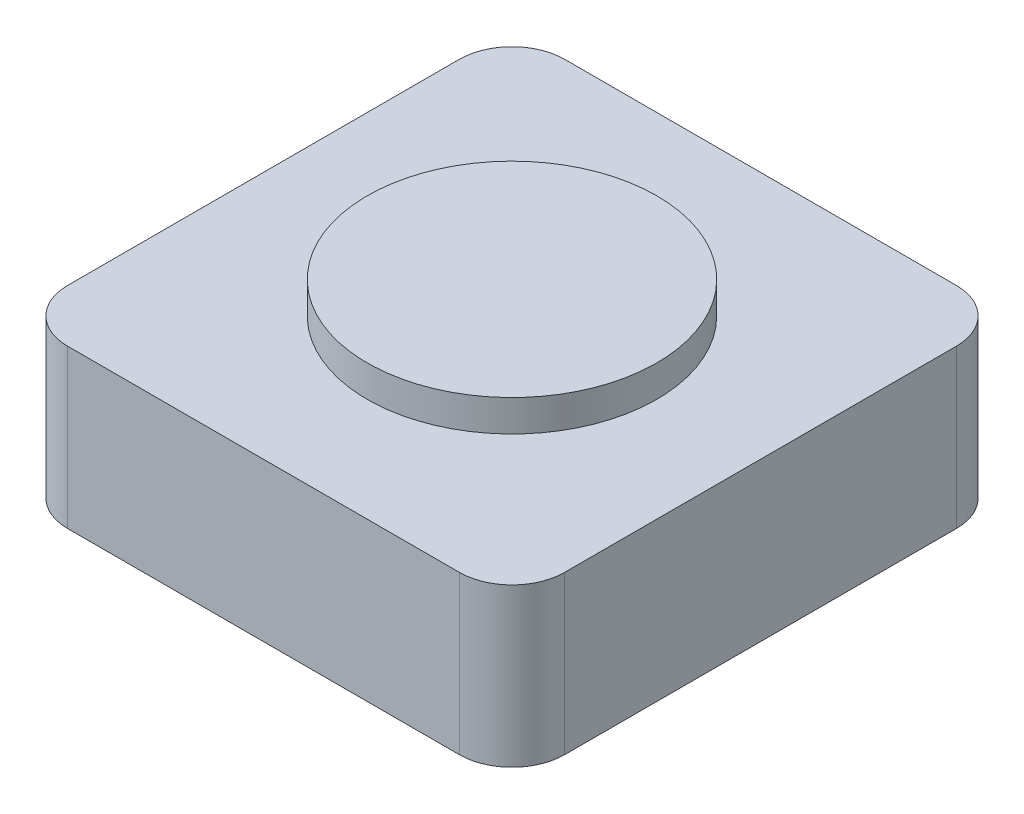
ISO-10303-21;
HEADER;
FILE_DESCRIPTION(('STEP AP214'),'2;1');
FILE_NAME('part.step','',(''),(''),'','','');
FILE_SCHEMA(('AUTOMOTIVE_DESIGN { 1 0 10303 214 1 1 1 1 }'));
ENDSEC;
DATA;
#1=APPLICATION_CONTEXT('core data for automotive mechanical design processes');
#2=APPLICATION_PROTOCOL_DEFINITION('international standard','automotive_design',2000,#1);
#3=PRODUCT_CONTEXT('',#1,'mechanical');
#4=PRODUCT('Part','Part','',(#3));
#5=PRODUCT_RELATED_PRODUCT_CATEGORY('part','',(#4));
#6=PRODUCT_DEFINITION_FORMATION('','',#4);
#7=PRODUCT_DEFINITION_CONTEXT('part definition',#1,'design');
#8=PRODUCT_DEFINITION('design','',#6,#7);
#9=PRODUCT_DEFINITION_SHAPE('','',#8);
#10=(LENGTH_UNIT() NAMED_UNIT(*) SI_UNIT(.MILLI.,.METRE.));
#11=(NAMED_UNIT(*) PLANE_ANGLE_UNIT() SI_UNIT($,.RADIAN.));
#12=(NAMED_UNIT(*) SI_UNIT($,.STERADIAN.) SOLID_ANGLE_UNIT());
#13=UNCERTAINTY_MEASURE_WITH_UNIT(LENGTH_MEASURE(1.E-05),#10,'distance_accuracy_value','');
#14=(GEOMETRIC_REPRESENTATION_CONTEXT(3) GLOBAL_UNCERTAINTY_ASSIGNED_CONTEXT((#13)) GLOBAL_UNIT_ASSIGNED_CONTEXT((#10,
#11,#12)) REPRESENTATION_CONTEXT('',''));
#15=CARTESIAN_POINT('',(0.,0.,0.));
#16=DIRECTION('',(0.,0.,1.));
#17=DIRECTION('',(1.,0.,0.));
#18=AXIS2_PLACEMENT_3D('',#15,#16,#17);
#19=CARTESIAN_POINT('',(5.9944,3.81,5.9944));
#20=DIRECTION('',(-1.,0.,0.));
#21=DIRECTION('',(0.,0.,1.));
#22=AXIS2_PLACEMENT_3D('',#19,#20,#21);
#23=PLANE('',#22);
#24=DIRECTION('',(0.,0.,-1.));
#25=VECTOR('',#24,1.);
#26=CARTESIAN_POINT('',(5.9944,3.81,5.9944));
#27=LINE('',#26,#25);
#28=CARTESIAN_POINT('',(5.9944,3.81,4.7244));
#29=VERTEX_POINT('',#28);
#30=CARTESIAN_POINT('',(5.9944,3.81,-4.7244));
#31=VERTEX_POINT('',#30);
#32=EDGE_CURVE('E118',#29,#31,#27,.T.);
#33=ORIENTED_EDGE('',*,*,#32,.F.);
#34=DIRECTION('',(0.,-1.,0.));
#35=VECTOR('',#34,1.);
#36=CARTESIAN_POINT('',(5.9944,3.81,4.7244));
#37=LINE('',#36,#35);
#38=CARTESIAN_POINT('',(5.9944,0.,4.7244));
#39=VERTEX_POINT('',#38);
#40=EDGE_CURVE('E103',#29,#39,#37,.T.);
#41=ORIENTED_EDGE('',*,*,#40,.T.);
#42=DIRECTION('',(0.,0.,-1.));
#43=VECTOR('',#42,1.);
#44=CARTESIAN_POINT('',(5.9944,0.,5.9944));
#45=LINE('',#44,#43);
#46=CARTESIAN_POINT('',(5.9944,0.,-4.7244));
#47=VERTEX_POINT('',#46);
#48=EDGE_CURVE('E115',#39,#47,#45,.T.);
#49=ORIENTED_EDGE('',*,*,#48,.T.);
#50=DIRECTION('',(0.,-1.,0.));
#51=VECTOR('',#50,1.);
#52=CARTESIAN_POINT('',(5.9944,3.81,-4.7244));
#53=LINE('',#52,#51);
#54=EDGE_CURVE('E120',#47,#31,#53,.F.);
#55=ORIENTED_EDGE('',*,*,#54,.T.);
#56=EDGE_LOOP('',(#33,#41,#49,#55));
#57=FACE_BOUND('',#56,.T.);
#58=ADVANCED_FACE('F32',(#57),#23,.F.);
#59=CARTESIAN_POINT('',(-5.9944,3.81,-5.9944));
#60=DIRECTION('',(0.,0.,1.));
#61=DIRECTION('',(1.,0.,0.));
#62=AXIS2_PLACEMENT_3D('',#59,#60,#61);
#63=PLANE('',#62);
#64=DIRECTION('',(-1.,0.,0.));
#65=VECTOR('',#64,1.);
#66=CARTESIAN_POINT('',(-5.9944,3.81,-5.9944));
#67=LINE('',#66,#65);
#68=CARTESIAN_POINT('',(4.7244,3.81,-5.9944));
#69=VERTEX_POINT('',#68);
#70=CARTESIAN_POINT('',(-4.7244,3.81,-5.9944));
#71=VERTEX_POINT('',#70);
#72=EDGE_CURVE('E164',#69,#71,#67,.T.);
#73=ORIENTED_EDGE('',*,*,#72,.F.);
#74=DIRECTION('',(0.,-1.,0.));
#75=VECTOR('',#74,1.);
#76=CARTESIAN_POINT('',(4.7244,3.81,-5.9944));
#77=LINE('',#76,#75);
#78=CARTESIAN_POINT('',(4.7244,0.,-5.9944));
#79=VERTEX_POINT('',#78);
#80=EDGE_CURVE('E11',#69,#79,#77,.T.);
#81=ORIENTED_EDGE('',*,*,#80,.T.);
#82=DIRECTION('',(-1.,0.,0.));
#83=VECTOR('',#82,1.);
#84=CARTESIAN_POINT('',(-5.9944,0.,-5.9944));
#85=LINE('',#84,#83);
#86=CARTESIAN_POINT('',(-4.7244,0.,-5.9944));
#87=VERTEX_POINT('',#86);
#88=EDGE_CURVE('E125',#79,#87,#85,.T.);
#89=ORIENTED_EDGE('',*,*,#88,.T.);
#90=DIRECTION('',(0.,-1.,0.));
#91=VECTOR('',#90,1.);
#92=CARTESIAN_POINT('',(-4.7244,3.81,-5.9944));
#93=LINE('',#92,#91);
#94=EDGE_CURVE('E40',#87,#71,#93,.F.);
#95=ORIENTED_EDGE('',*,*,#94,.T.);
#96=EDGE_LOOP('',(#73,#81,#89,#95));
#97=FACE_BOUND('',#96,.T.);
#98=ADVANCED_FACE('F163',(#97),#63,.F.);
#99=CARTESIAN_POINT('',(-5.9944,3.81,5.9944));
#100=DIRECTION('',(1.,0.,0.));
#101=DIRECTION('',(0.,0.,-1.));
#102=AXIS2_PLACEMENT_3D('',#99,#100,#101);
#103=PLANE('',#102);
#104=DIRECTION('',(0.,0.,1.));
#105=VECTOR('',#104,1.);
#106=CARTESIAN_POINT('',(-5.9944,0.,5.9944));
#107=LINE('',#106,#105);
#108=CARTESIAN_POINT('',(-5.9944,0.,-4.7244));
#109=VERTEX_POINT('',#108);
#110=CARTESIAN_POINT('',(-5.9944,0.,4.7244));
#111=VERTEX_POINT('',#110);
#112=EDGE_CURVE('E129',#109,#111,#107,.T.);
#113=ORIENTED_EDGE('',*,*,#112,.T.);
#114=DIRECTION('',(0.,-1.,0.));
#115=VECTOR('',#114,1.);
#116=CARTESIAN_POINT('',(-5.9944,3.81,4.7244));
#117=LINE('',#116,#115);
#118=CARTESIAN_POINT('',(-5.9944,3.81,4.7244));
#119=VERTEX_POINT('',#118);
#120=EDGE_CURVE('E47',#111,#119,#117,.F.);
#121=ORIENTED_EDGE('',*,*,#120,.T.);
#122=DIRECTION('',(0.,0.,1.));
#123=VECTOR('',#122,1.);
#124=CARTESIAN_POINT('',(-5.9944,3.81,5.9944));
#125=LINE('',#124,#123);
#126=CARTESIAN_POINT('',(-5.9944,3.81,-4.7244));
#127=VERTEX_POINT('',#126);
#128=EDGE_CURVE('E170',#127,#119,#125,.T.);
#129=ORIENTED_EDGE('',*,*,#128,.F.);
#130=DIRECTION('',(0.,-1.,0.));
#131=VECTOR('',#130,1.);
#132=CARTESIAN_POINT('',(-5.9944,3.81,-4.7244));
#133=LINE('',#132,#131);
#134=EDGE_CURVE('E157',#127,#109,#133,.T.);
#135=ORIENTED_EDGE('',*,*,#134,.T.);
#136=EDGE_LOOP('',(#113,#121,#129,#135));
#137=FACE_BOUND('',#136,.T.);
#138=ADVANCED_FACE('F174',(#137),#103,.F.);
#139=CARTESIAN_POINT('',(-5.9944,3.81,5.9944));
#140=DIRECTION('',(0.,0.,-1.));
#141=DIRECTION('',(-1.,0.,0.));
#142=AXIS2_PLACEMENT_3D('',#139,#140,#141);
#143=PLANE('',#142);
#144=DIRECTION('',(1.,0.,0.));
#145=VECTOR('',#144,1.);
#146=CARTESIAN_POINT('',(-5.9944,0.,5.9944));
#147=LINE('',#146,#145);
#148=CARTESIAN_POINT('',(-4.7244,0.,5.9944));
#149=VERTEX_POINT('',#148);
#150=CARTESIAN_POINT('',(4.7244,0.,5.9944));
#151=VERTEX_POINT('',#150);
#152=EDGE_CURVE('E138',#149,#151,#147,.T.);
#153=ORIENTED_EDGE('',*,*,#152,.T.);
#154=DIRECTION('',(0.,-1.,0.));
#155=VECTOR('',#154,1.);
#156=CARTESIAN_POINT('',(4.7244,3.81,5.9944));
#157=LINE('',#156,#155);
#158=CARTESIAN_POINT('',(4.7244,3.81,5.9944));
#159=VERTEX_POINT('',#158);
#160=EDGE_CURVE('E104',#151,#159,#157,.F.);
#161=ORIENTED_EDGE('',*,*,#160,.T.);
#162=DIRECTION('',(1.,0.,0.));
#163=VECTOR('',#162,1.);
#164=CARTESIAN_POINT('',(-5.9944,3.81,5.9944));
#165=LINE('',#164,#163);
#166=CARTESIAN_POINT('',(-4.7244,3.81,5.9944));
#167=VERTEX_POINT('',#166);
#168=EDGE_CURVE('E134',#167,#159,#165,.T.);
#169=ORIENTED_EDGE('',*,*,#168,.F.);
#170=DIRECTION('',(0.,-1.,0.));
#171=VECTOR('',#170,1.);
#172=CARTESIAN_POINT('',(-4.7244,3.81,5.9944));
#173=LINE('',#172,#171);
#174=EDGE_CURVE('E109',#167,#149,#173,.T.);
#175=ORIENTED_EDGE('',*,*,#174,.T.);
#176=EDGE_LOOP('',(#153,#161,#169,#175));
#177=FACE_BOUND('',#176,.T.);
#178=ADVANCED_FACE('F181',(#177),#143,.F.);
#179=CARTESIAN_POINT('',(0.,3.81,0.));
#180=DIRECTION('',(0.,-1.,0.));
#181=DIRECTION('',(0.,0.,-1.));
#182=AXIS2_PLACEMENT_3D('',#179,#180,#181);
#183=PLANE('',#182);
#184=CARTESIAN_POINT('',(0.,3.81,0.));
#185=DIRECTION('',(0.,-1.,0.));
#186=DIRECTION('',(0.,0.,-1.));
#187=AXIS2_PLACEMENT_3D('',#184,#185,#186);
#188=CIRCLE('',#187,3.4925);
#189=CARTESIAN_POINT('',(0.,3.81,-3.4925));
#190=VERTEX_POINT('',#189);
#191=EDGE_CURVE('E140',#190,#190,#188,.F.);
#192=ORIENTED_EDGE('',*,*,#191,.F.);
#193=EDGE_LOOP('',(#192));
#194=FACE_BOUND('',#193,.T.);
#195=ORIENTED_EDGE('',*,*,#168,.T.);
#196=CARTESIAN_POINT('',(4.7244,3.81,4.7244));
#197=DIRECTION('',(0.,-1.,0.));
#198=DIRECTION('',(0.,0.,-1.));
#199=AXIS2_PLACEMENT_3D('',#196,#197,#198);
#200=CIRCLE('',#199,1.27);
#201=EDGE_CURVE('E155',#159,#29,#200,.F.);
#202=ORIENTED_EDGE('',*,*,#201,.T.);
#203=ORIENTED_EDGE('',*,*,#32,.T.);
#204=CARTESIAN_POINT('',(4.7244,3.81,-4.7244));
#205=DIRECTION('',(0.,-1.,0.));
#206=DIRECTION('',(0.,0.,-1.));
#207=AXIS2_PLACEMENT_3D('',#204,#205,#206);
#208=CIRCLE('',#207,1.27);
#209=EDGE_CURVE('E151',#31,#69,#208,.F.);
#210=ORIENTED_EDGE('',*,*,#209,.T.);
#211=ORIENTED_EDGE('',*,*,#72,.T.);
#212=CARTESIAN_POINT('',(-4.7244,3.81,-4.7244));
#213=DIRECTION('',(0.,-1.,0.));
#214=DIRECTION('',(0.,0.,-1.));
#215=AXIS2_PLACEMENT_3D('',#212,#213,#214);
#216=CIRCLE('',#215,1.27);
#217=EDGE_CURVE('E54',#71,#127,#216,.F.);
#218=ORIENTED_EDGE('',*,*,#217,.T.);
#219=ORIENTED_EDGE('',*,*,#128,.T.);
#220=CARTESIAN_POINT('',(-4.7244,3.81,4.7244));
#221=DIRECTION('',(0.,-1.,0.));
#222=DIRECTION('',(0.,0.,-1.));
#223=AXIS2_PLACEMENT_3D('',#220,#221,#222);
#224=CIRCLE('',#223,1.27);
#225=EDGE_CURVE('E153',#119,#167,#224,.F.);
#226=ORIENTED_EDGE('',*,*,#225,.T.);
#227=EDGE_LOOP('',(#195,#202,#203,#210,#211,#218,#219,#226));
#228=FACE_BOUND('',#227,.T.);
#229=ADVANCED_FACE('F168',(#194,#228),#183,.F.);
#230=CARTESIAN_POINT('',(0.,0.,0.));
#231=DIRECTION('',(0.,-1.,0.));
#232=DIRECTION('',(0.,0.,-1.));
#233=AXIS2_PLACEMENT_3D('',#230,#231,#232);
#234=PLANE('',#233);
#235=ORIENTED_EDGE('',*,*,#48,.F.);
#236=CARTESIAN_POINT('',(4.7244,0.,4.7244));
#237=DIRECTION('',(0.,-1.,0.));
#238=DIRECTION('',(0.,0.,-1.));
#239=AXIS2_PLACEMENT_3D('',#236,#237,#238);
#240=CIRCLE('',#239,1.27);
#241=EDGE_CURVE('E99',#39,#151,#240,.T.);
#242=ORIENTED_EDGE('',*,*,#241,.T.);
#243=ORIENTED_EDGE('',*,*,#152,.F.);
#244=CARTESIAN_POINT('',(-4.7244,0.,4.7244));
#245=DIRECTION('',(0.,-1.,0.));
#246=DIRECTION('',(0.,0.,-1.));
#247=AXIS2_PLACEMENT_3D('',#244,#245,#246);
#248=CIRCLE('',#247,1.27);
#249=EDGE_CURVE('E110',#149,#111,#248,.T.);
#250=ORIENTED_EDGE('',*,*,#249,.T.);
#251=ORIENTED_EDGE('',*,*,#112,.F.);
#252=CARTESIAN_POINT('',(-4.7244,0.,-4.7244));
#253=DIRECTION('',(0.,-1.,0.));
#254=DIRECTION('',(0.,0.,-1.));
#255=AXIS2_PLACEMENT_3D('',#252,#253,#254);
#256=CIRCLE('',#255,1.27);
#257=EDGE_CURVE('E119',#109,#87,#256,.T.);
#258=ORIENTED_EDGE('',*,*,#257,.T.);
#259=ORIENTED_EDGE('',*,*,#88,.F.);
#260=CARTESIAN_POINT('',(4.7244,0.,-4.7244));
#261=DIRECTION('',(0.,-1.,0.));
#262=DIRECTION('',(0.,0.,-1.));
#263=AXIS2_PLACEMENT_3D('',#260,#261,#262);
#264=CIRCLE('',#263,1.27);
#265=EDGE_CURVE('E124',#79,#47,#264,.T.);
#266=ORIENTED_EDGE('',*,*,#265,.T.);
#267=EDGE_LOOP('',(#235,#242,#243,#250,#251,#258,#259,#266));
#268=FACE_BOUND('',#267,.T.);
#269=ADVANCED_FACE('F122',(#268),#234,.T.);
#270=CARTESIAN_POINT('',(0.,4.572,0.));
#271=DIRECTION('',(0.,-1.,0.));
#272=DIRECTION('',(0.,0.,-1.));
#273=AXIS2_PLACEMENT_3D('',#270,#271,#272);
#274=CYLINDRICAL_SURFACE('',#273,3.4925);
#275=CARTESIAN_POINT('',(0.,4.572,0.));
#276=DIRECTION('',(0.,1.,0.));
#277=DIRECTION('',(0.,0.,1.));
#278=AXIS2_PLACEMENT_3D('',#275,#276,#277);
#279=CIRCLE('',#278,3.4925);
#280=CARTESIAN_POINT('',(0.,4.572,-3.4925));
#281=VERTEX_POINT('',#280);
#282=EDGE_CURVE('E126',#281,#281,#279,.T.);
#283=CARTESIAN_POINT('',(0.,4.572,-3.4925));
#284=CARTESIAN_POINT('',(0.,4.5640625,-3.4925));
#285=CARTESIAN_POINT('',(0.,4.556125,-3.4925));
#286=CARTESIAN_POINT('',(0.,4.54025,-3.4925));
#287=CARTESIAN_POINT('',(0.,4.5323125,-3.4925));
#288=CARTESIAN_POINT('',(0.,4.5164375,-3.4925));
#289=CARTESIAN_POINT('',(0.,4.5085,-3.4925));
#290=CARTESIAN_POINT('',(0.,4.492625,-3.4925));
#291=CARTESIAN_POINT('',(0.,4.4846875,-3.4925));
#292=CARTESIAN_POINT('',(0.,4.4688125,-3.4925));
#293=CARTESIAN_POINT('',(0.,4.460875,-3.4925));
#294=CARTESIAN_POINT('',(0.,4.445,-3.4925));
#295=CARTESIAN_POINT('',(0.,4.4370625,-3.4925));
#296=CARTESIAN_POINT('',(0.,4.4211875,-3.4925));
#297=CARTESIAN_POINT('',(0.,4.41325,-3.4925));
#298=CARTESIAN_POINT('',(0.,4.397375,-3.4925));
#299=CARTESIAN_POINT('',(0.,4.3894375,-3.4925));
#300=CARTESIAN_POINT('',(0.,4.3735625,-3.4925));
#301=CARTESIAN_POINT('',(0.,4.365625,-3.4925));
#302=CARTESIAN_POINT('',(0.,4.34975,-3.4925));
#303=CARTESIAN_POINT('',(0.,4.3418125,-3.4925));
#304=CARTESIAN_POINT('',(0.,4.3259375,-3.4925));
#305=CARTESIAN_POINT('',(0.,4.318,-3.4925));
#306=CARTESIAN_POINT('',(0.,4.302125,-3.4925));
#307=CARTESIAN_POINT('',(0.,4.2941875,-3.4925));
#308=CARTESIAN_POINT('',(0.,4.2783125,-3.4925));
#309=CARTESIAN_POINT('',(0.,4.270375,-3.4925));
#310=CARTESIAN_POINT('',(0.,4.2545,-3.4925));
#311=CARTESIAN_POINT('',(0.,4.2465625,-3.4925));
#312=CARTESIAN_POINT('',(0.,4.2306875,-3.4925));
#313=CARTESIAN_POINT('',(0.,4.22275,-3.4925));
#314=CARTESIAN_POINT('',(0.,4.206875,-3.4925));
#315=CARTESIAN_POINT('',(0.,4.1989375,-3.4925));
#316=CARTESIAN_POINT('',(0.,4.1830625,-3.4925));
#317=CARTESIAN_POINT('',(0.,4.175125,-3.4925));
#318=CARTESIAN_POINT('',(0.,4.15925,-3.4925));
#319=CARTESIAN_POINT('',(0.,4.1513125,-3.4925));
#320=CARTESIAN_POINT('',(0.,4.1354375,-3.4925));
#321=CARTESIAN_POINT('',(0.,4.1275,-3.4925));
#322=CARTESIAN_POINT('',(0.,4.111625,-3.4925));
#323=CARTESIAN_POINT('',(0.,4.1036875,-3.4925));
#324=CARTESIAN_POINT('',(0.,4.0878125,-3.4925));
#325=CARTESIAN_POINT('',(0.,4.079875,-3.4925));
#326=CARTESIAN_POINT('',(0.,4.064,-3.4925));
#327=CARTESIAN_POINT('',(0.,4.0560625,-3.4925));
#328=CARTESIAN_POINT('',(0.,4.0401875,-3.4925));
#329=CARTESIAN_POINT('',(0.,4.03225,-3.4925));
#330=CARTESIAN_POINT('',(0.,4.016375,-3.4925));
#331=CARTESIAN_POINT('',(0.,4.0084375,-3.4925));
#332=CARTESIAN_POINT('',(0.,3.9925625,-3.4925));
#333=CARTESIAN_POINT('',(0.,3.984625,-3.4925));
#334=CARTESIAN_POINT('',(0.,3.96875,-3.4925));
#335=CARTESIAN_POINT('',(0.,3.9608125,-3.4925));
#336=CARTESIAN_POINT('',(0.,3.9449375,-3.4925));
#337=CARTESIAN_POINT('',(0.,3.937,-3.4925));
#338=CARTESIAN_POINT('',(0.,3.921125,-3.4925));
#339=CARTESIAN_POINT('',(0.,3.9131875,-3.4925));
#340=CARTESIAN_POINT('',(0.,3.8973125,-3.4925));
#341=CARTESIAN_POINT('',(0.,3.889375,-3.4925));
#342=CARTESIAN_POINT('',(0.,3.8735,-3.4925));
#343=CARTESIAN_POINT('',(0.,3.8655625,-3.4925));
#344=CARTESIAN_POINT('',(0.,3.8496875,-3.4925));
#345=CARTESIAN_POINT('',(0.,3.84175,-3.4925));
#346=CARTESIAN_POINT('',(0.,3.825875,-3.4925));
#347=CARTESIAN_POINT('',(0.,3.8179375,-3.4925));
#348=CARTESIAN_POINT('',(0.,3.81,-3.4925));
#349=B_SPLINE_CURVE_WITH_KNOTS('',3,(#283,#284,#285,#286,#287,#288,#289,#290,#291,#292,#293,
#294,#295,#296,#297,#298,#299,#300,#301,#302,#303,#304,#305,#306,#307,#308,#309,#310,#311,#312,
#313,#314,#315,#316,#317,#318,#319,#320,#321,#322,#323,#324,#325,#326,#327,#328,#329,#330,#331,
#332,#333,#334,#335,#336,#337,#338,#339,#340,#341,#342,#343,#344,#345,#346,#347,#348),
.UNSPECIFIED.,.F.,.F.,(4,2,2,2,2,2,2,2,2,2,2,2,2,2,2,2,2,2,2,2,2,2,2,2,2,2,2,2,2,2,2,2,4),(0.,
0.0238125000000004,0.0476250000000008,0.0714375000000003,0.0952500000000007,0.1190625,
0.142875000000001,0.1666875,0.190500000000001,0.2143125,0.238125,0.2619375,0.28575,0.3095625,
0.333375,0.3571875,0.381,0.4048125,0.428625,0.452437500000001,0.47625,0.500062500000001,
0.523875,0.5476875,0.5715,0.5953125,0.619125,0.6429375,0.66675,0.6905625,0.714375,0.7381875,
0.762),.UNSPECIFIED.);
#350=EDGE_CURVE('BSEAM204',#281,#190,#349,.T.);
#351=ORIENTED_EDGE('',*,*,#282,.F.);
#352=ORIENTED_EDGE('',*,*,#191,.T.);
#353=ORIENTED_EDGE('',*,*,#350,.T.);
#354=ORIENTED_EDGE('',*,*,#350,.F.);
#355=EDGE_LOOP('',(#351,#353,#352,#354));
#356=FACE_BOUND('',#355,.T.);
#357=ADVANCED_FACE('F204',(#356),#274,.T.);
#358=CARTESIAN_POINT('',(0.,4.572,0.));
#359=DIRECTION('',(0.,1.,0.));
#360=DIRECTION('',(0.,0.,1.));
#361=AXIS2_PLACEMENT_3D('',#358,#359,#360);
#362=PLANE('',#361);
#363=ORIENTED_EDGE('',*,*,#282,.T.);
#364=EDGE_LOOP('',(#363));
#365=FACE_BOUND('',#364,.T.);
#366=ADVANCED_FACE('F200',(#365),#362,.T.);
#367=CARTESIAN_POINT('',(4.7244,3.81,4.7244));
#368=DIRECTION('',(0.,-1.,0.));
#369=DIRECTION('',(0.,0.,-1.));
#370=AXIS2_PLACEMENT_3D('',#367,#368,#369);
#371=CYLINDRICAL_SURFACE('',#370,1.27);
#372=ORIENTED_EDGE('',*,*,#201,.F.);
#373=ORIENTED_EDGE('',*,*,#160,.F.);
#374=ORIENTED_EDGE('',*,*,#241,.F.);
#375=ORIENTED_EDGE('',*,*,#40,.F.);
#376=EDGE_LOOP('',(#372,#373,#374,#375));
#377=FACE_BOUND('',#376,.T.);
#378=ADVANCED_FACE('F102',(#377),#371,.T.);
#379=CARTESIAN_POINT('',(-4.7244,3.81,4.7244));
#380=DIRECTION('',(0.,-1.,0.));
#381=DIRECTION('',(0.,0.,-1.));
#382=AXIS2_PLACEMENT_3D('',#379,#380,#381);
#383=CYLINDRICAL_SURFACE('',#382,1.27);
#384=ORIENTED_EDGE('',*,*,#225,.F.);
#385=ORIENTED_EDGE('',*,*,#120,.F.);
#386=ORIENTED_EDGE('',*,*,#249,.F.);
#387=ORIENTED_EDGE('',*,*,#174,.F.);
#388=EDGE_LOOP('',(#384,#385,#386,#387));
#389=FACE_BOUND('',#388,.T.);
#390=ADVANCED_FACE('F178',(#389),#383,.T.);
#391=CARTESIAN_POINT('',(4.7244,3.81,-4.7244));
#392=DIRECTION('',(0.,-1.,0.));
#393=DIRECTION('',(0.,0.,-1.));
#394=AXIS2_PLACEMENT_3D('',#391,#392,#393);
#395=CYLINDRICAL_SURFACE('',#394,1.27);
#396=ORIENTED_EDGE('',*,*,#209,.F.);
#397=ORIENTED_EDGE('',*,*,#54,.F.);
#398=ORIENTED_EDGE('',*,*,#265,.F.);
#399=ORIENTED_EDGE('',*,*,#80,.F.);
#400=EDGE_LOOP('',(#396,#397,#398,#399));
#401=FACE_BOUND('',#400,.T.);
#402=ADVANCED_FACE('F184',(#401),#395,.T.);
#403=CARTESIAN_POINT('',(-4.7244,3.81,-4.7244));
#404=DIRECTION('',(0.,-1.,0.));
#405=DIRECTION('',(0.,0.,-1.));
#406=AXIS2_PLACEMENT_3D('',#403,#404,#405);
#407=CYLINDRICAL_SURFACE('',#406,1.27);
#408=ORIENTED_EDGE('',*,*,#217,.F.);
#409=ORIENTED_EDGE('',*,*,#94,.F.);
#410=ORIENTED_EDGE('',*,*,#257,.F.);
#411=ORIENTED_EDGE('',*,*,#134,.F.);
#412=EDGE_LOOP('',(#408,#409,#410,#411));
#413=FACE_BOUND('',#412,.T.);
#414=ADVANCED_FACE('F34',(#413),#407,.T.);
#415=CLOSED_SHELL('',(#58,#98,#138,#178,#229,#269,#357,#366,#378,#390,#402,#414));
#416=MANIFOLD_SOLID_BREP('B2',#415);
#417=ADVANCED_BREP_SHAPE_REPRESENTATION('',(#18,#416),#14);
#418=SHAPE_DEFINITION_REPRESENTATION(#9,#417);
ENDSEC;
END-ISO-10303-21;
